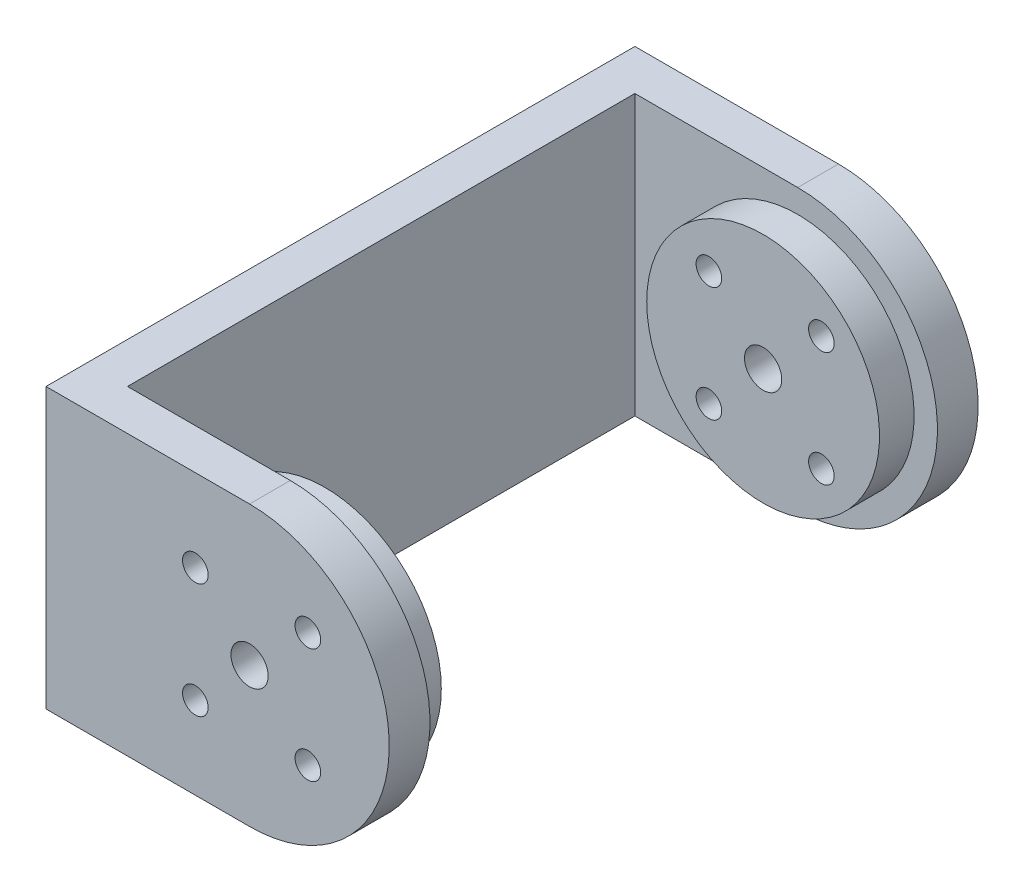
ISO-10303-21;
HEADER;
FILE_DESCRIPTION(('STEP AP214'),'2;1');
FILE_NAME('part.step','',(''),(''),'','','');
FILE_SCHEMA(('AUTOMOTIVE_DESIGN { 1 0 10303 214 1 1 1 1 }'));
ENDSEC;
DATA;
#1=APPLICATION_CONTEXT('core data for automotive mechanical design processes');
#2=APPLICATION_PROTOCOL_DEFINITION('international standard','automotive_design',2000,#1);
#3=PRODUCT_CONTEXT('',#1,'mechanical');
#4=PRODUCT('Part','Part','',(#3));
#5=PRODUCT_RELATED_PRODUCT_CATEGORY('part','',(#4));
#6=PRODUCT_DEFINITION_FORMATION('','',#4);
#7=PRODUCT_DEFINITION_CONTEXT('part definition',#1,'design');
#8=PRODUCT_DEFINITION('design','',#6,#7);
#9=PRODUCT_DEFINITION_SHAPE('','',#8);
#10=(LENGTH_UNIT() NAMED_UNIT(*) SI_UNIT(.MILLI.,.METRE.));
#11=(NAMED_UNIT(*) PLANE_ANGLE_UNIT() SI_UNIT($,.RADIAN.));
#12=(NAMED_UNIT(*) SI_UNIT($,.STERADIAN.) SOLID_ANGLE_UNIT());
#13=UNCERTAINTY_MEASURE_WITH_UNIT(LENGTH_MEASURE(1.E-05),#10,'distance_accuracy_value','');
#14=(GEOMETRIC_REPRESENTATION_CONTEXT(3) GLOBAL_UNCERTAINTY_ASSIGNED_CONTEXT((#13)) GLOBAL_UNIT_ASSIGNED_CONTEXT((#10,
#11,#12)) REPRESENTATION_CONTEXT('',''));
#15=CARTESIAN_POINT('',(0.,0.,0.));
#16=DIRECTION('',(0.,0.,1.));
#17=DIRECTION('',(1.,0.,0.));
#18=AXIS2_PLACEMENT_3D('',#15,#16,#17);
#19=CARTESIAN_POINT('',(-15.755,0.,25.3));
#20=DIRECTION('',(0.,0.,1.));
#21=DIRECTION('',(1.,0.,0.));
#22=AXIS2_PLACEMENT_3D('',#19,#20,#21);
#23=PLANE('',#22);
#24=CARTESIAN_POINT('',(-17.669,-4.934,25.3));
#25=DIRECTION('',(0.,0.,1.));
#26=DIRECTION('',(1.,0.,0.));
#27=AXIS2_PLACEMENT_3D('',#24,#25,#26);
#28=CIRCLE('',#27,1.1);
#29=CARTESIAN_POINT('',(-16.569,-4.934,25.3));
#30=VERTEX_POINT('',#29);
#31=EDGE_CURVE('E136',#30,#30,#28,.T.);
#32=ORIENTED_EDGE('',*,*,#31,.F.);
#33=EDGE_LOOP('',(#32));
#34=FACE_BOUND('',#33,.T.);
#35=CARTESIAN_POINT('',(-17.669,4.934,25.3));
#36=DIRECTION('',(0.,0.,1.));
#37=DIRECTION('',(1.,0.,0.));
#38=AXIS2_PLACEMENT_3D('',#35,#36,#37);
#39=CIRCLE('',#38,1.1);
#40=CARTESIAN_POINT('',(-16.569,4.934,25.3));
#41=VERTEX_POINT('',#40);
#42=EDGE_CURVE('E134',#41,#41,#39,.T.);
#43=ORIENTED_EDGE('',*,*,#42,.F.);
#44=EDGE_LOOP('',(#43));
#45=FACE_BOUND('',#44,.T.);
#46=CARTESIAN_POINT('',(-8.001,-4.934,25.3));
#47=DIRECTION('',(0.,0.,1.));
#48=DIRECTION('',(1.,0.,0.));
#49=AXIS2_PLACEMENT_3D('',#46,#47,#48);
#50=CIRCLE('',#49,1.1);
#51=CARTESIAN_POINT('',(-6.901,-4.934,25.3));
#52=VERTEX_POINT('',#51);
#53=EDGE_CURVE('E131',#52,#52,#50,.T.);
#54=ORIENTED_EDGE('',*,*,#53,.F.);
#55=EDGE_LOOP('',(#54));
#56=FACE_BOUND('',#55,.T.);
#57=CARTESIAN_POINT('',(-8.001,4.934,25.3));
#58=DIRECTION('',(0.,0.,1.));
#59=DIRECTION('',(1.,0.,0.));
#60=AXIS2_PLACEMENT_3D('',#57,#58,#59);
#61=CIRCLE('',#60,1.1);
#62=CARTESIAN_POINT('',(-6.901,4.934,25.3));
#63=VERTEX_POINT('',#62);
#64=EDGE_CURVE('E130',#63,#63,#61,.T.);
#65=ORIENTED_EDGE('',*,*,#64,.F.);
#66=EDGE_LOOP('',(#65));
#67=FACE_BOUND('',#66,.T.);
#68=CARTESIAN_POINT('',(-13.01,0.,25.3));
#69=DIRECTION('',(0.,0.,1.));
#70=DIRECTION('',(1.,0.,0.));
#71=AXIS2_PLACEMENT_3D('',#68,#69,#70);
#72=CIRCLE('',#71,1.6);
#73=CARTESIAN_POINT('',(-11.41,0.,25.3));
#74=VERTEX_POINT('',#73);
#75=EDGE_CURVE('E178',#74,#74,#72,.T.);
#76=ORIENTED_EDGE('',*,*,#75,.F.);
#77=EDGE_LOOP('',(#76));
#78=FACE_BOUND('',#77,.T.);
#79=CARTESIAN_POINT('',(-13.01,0.,25.3));
#80=DIRECTION('',(0.,0.,1.));
#81=DIRECTION('',(1.,0.,0.));
#82=AXIS2_PLACEMENT_3D('',#79,#80,#81);
#83=CIRCLE('',#82,12.);
#84=CARTESIAN_POINT('',(-13.01,-12.,25.3));
#85=VERTEX_POINT('',#84);
#86=CARTESIAN_POINT('',(-13.01,12.,25.3));
#87=VERTEX_POINT('',#86);
#88=EDGE_CURVE('E78',#85,#87,#83,.T.);
#89=ORIENTED_EDGE('',*,*,#88,.T.);
#90=DIRECTION('',(1.,0.,0.));
#91=VECTOR('',#90,1.);
#92=CARTESIAN_POINT('',(-15.755,12.,25.3));
#93=LINE('',#92,#91);
#94=CARTESIAN_POINT('',(-30.5,12.,25.3));
#95=VERTEX_POINT('',#94);
#96=EDGE_CURVE('E85',#95,#87,#93,.T.);
#97=ORIENTED_EDGE('',*,*,#96,.F.);
#98=DIRECTION('',(0.,1.,0.));
#99=VECTOR('',#98,1.);
#100=CARTESIAN_POINT('',(-30.5,0.,25.3));
#101=LINE('',#100,#99);
#102=CARTESIAN_POINT('',(-30.5,-12.,25.3));
#103=VERTEX_POINT('',#102);
#104=EDGE_CURVE('E99',#103,#95,#101,.T.);
#105=ORIENTED_EDGE('',*,*,#104,.F.);
#106=DIRECTION('',(-1.,0.,0.));
#107=VECTOR('',#106,1.);
#108=CARTESIAN_POINT('',(-15.755,-12.,25.3));
#109=LINE('',#108,#107);
#110=EDGE_CURVE('E36',#85,#103,#109,.T.);
#111=ORIENTED_EDGE('',*,*,#110,.F.);
#112=EDGE_LOOP('',(#89,#97,#105,#111));
#113=FACE_BOUND('',#112,.T.);
#114=ADVANCED_FACE('F15',(#34,#45,#56,#67,#78,#113),#23,.T.);
#115=CARTESIAN_POINT('',(-15.755,-12.,-25.3));
#116=DIRECTION('',(0.,-1.,0.));
#117=DIRECTION('',(0.,0.,-1.));
#118=AXIS2_PLACEMENT_3D('',#115,#116,#117);
#119=PLANE('',#118);
#120=DIRECTION('',(1.,0.,0.));
#121=VECTOR('',#120,1.);
#122=CARTESIAN_POINT('',(-15.755,-12.,-25.3));
#123=LINE('',#122,#121);
#124=CARTESIAN_POINT('',(-30.5,-12.,-25.3));
#125=VERTEX_POINT('',#124);
#126=CARTESIAN_POINT('',(-13.01,-12.,-25.3));
#127=VERTEX_POINT('',#126);
#128=EDGE_CURVE('E203',#125,#127,#123,.T.);
#129=ORIENTED_EDGE('',*,*,#128,.T.);
#130=DIRECTION('',(0.,0.,1.));
#131=VECTOR('',#130,1.);
#132=CARTESIAN_POINT('',(-13.01,-12.,-27.3));
#133=LINE('',#132,#131);
#134=CARTESIAN_POINT('',(-13.01,-12.,-21.8));
#135=VERTEX_POINT('',#134);
#136=EDGE_CURVE('E181',#127,#135,#133,.T.);
#137=ORIENTED_EDGE('',*,*,#136,.T.);
#138=DIRECTION('',(1.,0.,0.));
#139=VECTOR('',#138,1.);
#140=CARTESIAN_POINT('',(-15.755,-12.,-21.8));
#141=LINE('',#140,#139);
#142=CARTESIAN_POINT('',(-27.,-12.,-21.8));
#143=VERTEX_POINT('',#142);
#144=EDGE_CURVE('E189',#143,#135,#141,.T.);
#145=ORIENTED_EDGE('',*,*,#144,.F.);
#146=DIRECTION('',(0.,0.,-1.));
#147=VECTOR('',#146,1.);
#148=CARTESIAN_POINT('',(-27.,-12.,-25.3));
#149=LINE('',#148,#147);
#150=CARTESIAN_POINT('',(-27.,-12.,21.8));
#151=VERTEX_POINT('',#150);
#152=EDGE_CURVE('E200',#151,#143,#149,.T.);
#153=ORIENTED_EDGE('',*,*,#152,.F.);
#154=DIRECTION('',(-1.,0.,0.));
#155=VECTOR('',#154,1.);
#156=CARTESIAN_POINT('',(-15.755,-12.,21.8));
#157=LINE('',#156,#155);
#158=CARTESIAN_POINT('',(-13.01,-12.,21.8));
#159=VERTEX_POINT('',#158);
#160=EDGE_CURVE('E111',#159,#151,#157,.T.);
#161=ORIENTED_EDGE('',*,*,#160,.F.);
#162=EDGE_CURVE('E33',#159,#85,#133,.T.);
#163=ORIENTED_EDGE('',*,*,#162,.T.);
#164=ORIENTED_EDGE('',*,*,#110,.T.);
#165=DIRECTION('',(0.,0.,1.));
#166=VECTOR('',#165,1.);
#167=CARTESIAN_POINT('',(-30.5,-12.,-25.3));
#168=LINE('',#167,#166);
#169=EDGE_CURVE('E101',#125,#103,#168,.T.);
#170=ORIENTED_EDGE('',*,*,#169,.F.);
#171=EDGE_LOOP('',(#129,#137,#145,#153,#161,#163,#164,#170));
#172=FACE_BOUND('',#171,.T.);
#173=ADVANCED_FACE('F220',(#172),#119,.T.);
#174=CARTESIAN_POINT('',(-15.755,0.,-25.3));
#175=DIRECTION('',(0.,0.,-1.));
#176=DIRECTION('',(-1.,0.,0.));
#177=AXIS2_PLACEMENT_3D('',#174,#175,#176);
#178=PLANE('',#177);
#179=CARTESIAN_POINT('',(-17.669,-4.934,-25.3));
#180=DIRECTION('',(0.,0.,-1.));
#181=DIRECTION('',(-1.,0.,0.));
#182=AXIS2_PLACEMENT_3D('',#179,#180,#181);
#183=CIRCLE('',#182,1.1);
#184=CARTESIAN_POINT('',(-18.769,-4.934,-25.3));
#185=VERTEX_POINT('',#184);
#186=EDGE_CURVE('E148',#185,#185,#183,.T.);
#187=ORIENTED_EDGE('',*,*,#186,.F.);
#188=EDGE_LOOP('',(#187));
#189=FACE_BOUND('',#188,.T.);
#190=CARTESIAN_POINT('',(-17.669,4.934,-25.3));
#191=DIRECTION('',(0.,0.,-1.));
#192=DIRECTION('',(-1.,0.,0.));
#193=AXIS2_PLACEMENT_3D('',#190,#191,#192);
#194=CIRCLE('',#193,1.1);
#195=CARTESIAN_POINT('',(-18.769,4.934,-25.3));
#196=VERTEX_POINT('',#195);
#197=EDGE_CURVE('E141',#196,#196,#194,.T.);
#198=ORIENTED_EDGE('',*,*,#197,.F.);
#199=EDGE_LOOP('',(#198));
#200=FACE_BOUND('',#199,.T.);
#201=CARTESIAN_POINT('',(-8.001,-4.934,-25.3));
#202=DIRECTION('',(0.,0.,-1.));
#203=DIRECTION('',(-1.,0.,0.));
#204=AXIS2_PLACEMENT_3D('',#201,#202,#203);
#205=CIRCLE('',#204,1.1);
#206=CARTESIAN_POINT('',(-9.101,-4.934,-25.3));
#207=VERTEX_POINT('',#206);
#208=EDGE_CURVE('E161',#207,#207,#205,.T.);
#209=ORIENTED_EDGE('',*,*,#208,.F.);
#210=EDGE_LOOP('',(#209));
#211=FACE_BOUND('',#210,.T.);
#212=CARTESIAN_POINT('',(-8.001,4.934,-25.3));
#213=DIRECTION('',(0.,0.,-1.));
#214=DIRECTION('',(-1.,0.,0.));
#215=AXIS2_PLACEMENT_3D('',#212,#213,#214);
#216=CIRCLE('',#215,1.1);
#217=CARTESIAN_POINT('',(-9.101,4.934,-25.3));
#218=VERTEX_POINT('',#217);
#219=EDGE_CURVE('E169',#218,#218,#216,.T.);
#220=ORIENTED_EDGE('',*,*,#219,.F.);
#221=EDGE_LOOP('',(#220));
#222=FACE_BOUND('',#221,.T.);
#223=CARTESIAN_POINT('',(-13.01,0.,-25.3));
#224=DIRECTION('',(0.,0.,-1.));
#225=DIRECTION('',(-1.,0.,0.));
#226=AXIS2_PLACEMENT_3D('',#223,#224,#225);
#227=CIRCLE('',#226,1.6);
#228=CARTESIAN_POINT('',(-14.61,0.,-25.3));
#229=VERTEX_POINT('',#228);
#230=EDGE_CURVE('E175',#229,#229,#227,.T.);
#231=ORIENTED_EDGE('',*,*,#230,.F.);
#232=EDGE_LOOP('',(#231));
#233=FACE_BOUND('',#232,.T.);
#234=DIRECTION('',(-1.,0.,0.));
#235=VECTOR('',#234,1.);
#236=CARTESIAN_POINT('',(-15.755,12.,-25.3));
#237=LINE('',#236,#235);
#238=CARTESIAN_POINT('',(-13.01,12.,-25.3));
#239=VERTEX_POINT('',#238);
#240=CARTESIAN_POINT('',(-30.5,12.,-25.3));
#241=VERTEX_POINT('',#240);
#242=EDGE_CURVE('E202',#239,#241,#237,.T.);
#243=ORIENTED_EDGE('',*,*,#242,.F.);
#244=CARTESIAN_POINT('',(-13.01,0.,-25.3));
#245=DIRECTION('',(0.,0.,-1.));
#246=DIRECTION('',(-1.,0.,0.));
#247=AXIS2_PLACEMENT_3D('',#244,#245,#246);
#248=CIRCLE('',#247,12.);
#249=EDGE_CURVE('E83',#239,#127,#248,.T.);
#250=ORIENTED_EDGE('',*,*,#249,.T.);
#251=ORIENTED_EDGE('',*,*,#128,.F.);
#252=DIRECTION('',(0.,-1.,0.));
#253=VECTOR('',#252,1.);
#254=CARTESIAN_POINT('',(-30.5,0.,-25.3));
#255=LINE('',#254,#253);
#256=EDGE_CURVE('E204',#241,#125,#255,.T.);
#257=ORIENTED_EDGE('',*,*,#256,.F.);
#258=EDGE_LOOP('',(#243,#250,#251,#257));
#259=FACE_BOUND('',#258,.T.);
#260=ADVANCED_FACE('F212',(#189,#200,#211,#222,#233,#259),#178,.T.);
#261=CARTESIAN_POINT('',(-13.005,0.,21.8));
#262=DIRECTION('',(0.,0.,1.));
#263=DIRECTION('',(1.,0.,0.));
#264=AXIS2_PLACEMENT_3D('',#261,#262,#263);
#265=PLANE('',#264);
#266=CARTESIAN_POINT('',(-13.01,0.,21.8));
#267=DIRECTION('',(0.,0.,1.));
#268=DIRECTION('',(1.,0.,0.));
#269=AXIS2_PLACEMENT_3D('',#266,#267,#268);
#270=CIRCLE('',#269,10.);
#271=CARTESIAN_POINT('',(-3.01,0.,21.8));
#272=VERTEX_POINT('',#271);
#273=EDGE_CURVE('E194',#272,#272,#270,.T.);
#274=ORIENTED_EDGE('',*,*,#273,.T.);
#275=EDGE_LOOP('',(#274));
#276=FACE_BOUND('',#275,.T.);
#277=DIRECTION('',(1.,0.,0.));
#278=VECTOR('',#277,1.);
#279=CARTESIAN_POINT('',(-15.755,12.,21.8));
#280=LINE('',#279,#278);
#281=CARTESIAN_POINT('',(-27.,12.,21.8));
#282=VERTEX_POINT('',#281);
#283=CARTESIAN_POINT('',(-13.01,12.,21.8));
#284=VERTEX_POINT('',#283);
#285=EDGE_CURVE('E23',#282,#284,#280,.T.);
#286=ORIENTED_EDGE('',*,*,#285,.T.);
#287=CARTESIAN_POINT('',(-13.01,0.,21.8));
#288=DIRECTION('',(0.,0.,1.));
#289=DIRECTION('',(1.,0.,0.));
#290=AXIS2_PLACEMENT_3D('',#287,#288,#289);
#291=CIRCLE('',#290,12.);
#292=EDGE_CURVE('E89',#159,#284,#291,.T.);
#293=ORIENTED_EDGE('',*,*,#292,.F.);
#294=ORIENTED_EDGE('',*,*,#160,.T.);
#295=DIRECTION('',(0.,1.,0.));
#296=VECTOR('',#295,1.);
#297=CARTESIAN_POINT('',(-27.,0.,21.8));
#298=LINE('',#297,#296);
#299=EDGE_CURVE('E113',#151,#282,#298,.T.);
#300=ORIENTED_EDGE('',*,*,#299,.T.);
#301=EDGE_LOOP('',(#286,#293,#294,#300));
#302=FACE_BOUND('',#301,.T.);
#303=ADVANCED_FACE('F235',(#276,#302),#265,.F.);
#304=CARTESIAN_POINT('',(-13.005,0.,-21.8));
#305=DIRECTION('',(0.,0.,-1.));
#306=DIRECTION('',(-1.,0.,0.));
#307=AXIS2_PLACEMENT_3D('',#304,#305,#306);
#308=PLANE('',#307);
#309=CARTESIAN_POINT('',(-13.01,0.,-21.8));
#310=DIRECTION('',(0.,0.,-1.));
#311=DIRECTION('',(-1.,0.,0.));
#312=AXIS2_PLACEMENT_3D('',#309,#310,#311);
#313=CIRCLE('',#312,10.);
#314=CARTESIAN_POINT('',(-23.01,0.,-21.8));
#315=VERTEX_POINT('',#314);
#316=EDGE_CURVE('E81',#315,#315,#313,.T.);
#317=ORIENTED_EDGE('',*,*,#316,.T.);
#318=EDGE_LOOP('',(#317));
#319=FACE_BOUND('',#318,.T.);
#320=CARTESIAN_POINT('',(-13.01,0.,-21.8));
#321=DIRECTION('',(0.,0.,-1.));
#322=DIRECTION('',(-1.,0.,0.));
#323=AXIS2_PLACEMENT_3D('',#320,#321,#322);
#324=CIRCLE('',#323,12.);
#325=CARTESIAN_POINT('',(-13.01,12.,-21.8));
#326=VERTEX_POINT('',#325);
#327=EDGE_CURVE('E9',#326,#135,#324,.T.);
#328=ORIENTED_EDGE('',*,*,#327,.F.);
#329=DIRECTION('',(-1.,0.,0.));
#330=VECTOR('',#329,1.);
#331=CARTESIAN_POINT('',(-15.755,12.,-21.8));
#332=LINE('',#331,#330);
#333=CARTESIAN_POINT('',(-27.,12.,-21.8));
#334=VERTEX_POINT('',#333);
#335=EDGE_CURVE('E118',#326,#334,#332,.T.);
#336=ORIENTED_EDGE('',*,*,#335,.T.);
#337=DIRECTION('',(0.,-1.,0.));
#338=VECTOR('',#337,1.);
#339=CARTESIAN_POINT('',(-27.,0.,-21.8));
#340=LINE('',#339,#338);
#341=EDGE_CURVE('E120',#334,#143,#340,.T.);
#342=ORIENTED_EDGE('',*,*,#341,.T.);
#343=ORIENTED_EDGE('',*,*,#144,.T.);
#344=EDGE_LOOP('',(#328,#336,#342,#343));
#345=FACE_BOUND('',#344,.T.);
#346=ADVANCED_FACE('F225',(#319,#345),#308,.F.);
#347=CARTESIAN_POINT('',(-30.5,0.,-25.3));
#348=DIRECTION('',(-1.,0.,0.));
#349=DIRECTION('',(0.,0.,1.));
#350=AXIS2_PLACEMENT_3D('',#347,#348,#349);
#351=PLANE('',#350);
#352=ORIENTED_EDGE('',*,*,#169,.T.);
#353=ORIENTED_EDGE('',*,*,#104,.T.);
#354=DIRECTION('',(0.,0.,1.));
#355=VECTOR('',#354,1.);
#356=CARTESIAN_POINT('',(-30.5,12.,-25.3));
#357=LINE('',#356,#355);
#358=EDGE_CURVE('E97',#241,#95,#357,.T.);
#359=ORIENTED_EDGE('',*,*,#358,.F.);
#360=ORIENTED_EDGE('',*,*,#256,.T.);
#361=EDGE_LOOP('',(#352,#353,#359,#360));
#362=FACE_BOUND('',#361,.T.);
#363=ADVANCED_FACE('F211',(#362),#351,.T.);
#364=CARTESIAN_POINT('',(-15.755,12.,-25.3));
#365=DIRECTION('',(0.,1.,0.));
#366=DIRECTION('',(0.,0.,1.));
#367=AXIS2_PLACEMENT_3D('',#364,#365,#366);
#368=PLANE('',#367);
#369=DIRECTION('',(0.,0.,1.));
#370=VECTOR('',#369,1.);
#371=CARTESIAN_POINT('',(-13.01,12.,-27.3));
#372=LINE('',#371,#370);
#373=EDGE_CURVE('E94',#326,#239,#372,.F.);
#374=ORIENTED_EDGE('',*,*,#373,.T.);
#375=ORIENTED_EDGE('',*,*,#242,.T.);
#376=ORIENTED_EDGE('',*,*,#358,.T.);
#377=ORIENTED_EDGE('',*,*,#96,.T.);
#378=EDGE_CURVE('E86',#87,#284,#372,.F.);
#379=ORIENTED_EDGE('',*,*,#378,.T.);
#380=ORIENTED_EDGE('',*,*,#285,.F.);
#381=DIRECTION('',(0.,0.,1.));
#382=VECTOR('',#381,1.);
#383=CARTESIAN_POINT('',(-27.,12.,-25.3));
#384=LINE('',#383,#382);
#385=EDGE_CURVE('E108',#334,#282,#384,.T.);
#386=ORIENTED_EDGE('',*,*,#385,.F.);
#387=ORIENTED_EDGE('',*,*,#335,.F.);
#388=EDGE_LOOP('',(#374,#375,#376,#377,#379,#380,#386,#387));
#389=FACE_BOUND('',#388,.T.);
#390=ADVANCED_FACE('F100',(#389),#368,.T.);
#391=CARTESIAN_POINT('',(-27.,0.,-18.825));
#392=DIRECTION('',(-1.,0.,0.));
#393=DIRECTION('',(0.,0.,1.));
#394=AXIS2_PLACEMENT_3D('',#391,#392,#393);
#395=PLANE('',#394);
#396=ORIENTED_EDGE('',*,*,#152,.T.);
#397=ORIENTED_EDGE('',*,*,#341,.F.);
#398=ORIENTED_EDGE('',*,*,#385,.T.);
#399=ORIENTED_EDGE('',*,*,#299,.F.);
#400=EDGE_LOOP('',(#396,#397,#398,#399));
#401=FACE_BOUND('',#400,.T.);
#402=ADVANCED_FACE('F229',(#401),#395,.F.);
#403=CARTESIAN_POINT('',(-13.01,0.,17.825));
#404=DIRECTION('',(0.,0.,1.));
#405=DIRECTION('',(1.,0.,0.));
#406=AXIS2_PLACEMENT_3D('',#403,#404,#405);
#407=CYLINDRICAL_SURFACE('',#406,10.);
#408=ORIENTED_EDGE('',*,*,#273,.F.);
#409=EDGE_LOOP('',(#408));
#410=FACE_BOUND('',#409,.T.);
#411=CARTESIAN_POINT('',(-13.01,0.,18.825));
#412=DIRECTION('',(0.,0.,1.));
#413=DIRECTION('',(1.,0.,0.));
#414=AXIS2_PLACEMENT_3D('',#411,#412,#413);
#415=CIRCLE('',#414,10.);
#416=CARTESIAN_POINT('',(-3.01,0.,18.825));
#417=VERTEX_POINT('',#416);
#418=EDGE_CURVE('E112',#417,#417,#415,.T.);
#419=ORIENTED_EDGE('',*,*,#418,.T.);
#420=EDGE_LOOP('',(#419));
#421=FACE_BOUND('',#420,.T.);
#422=ADVANCED_FACE('F271',(#410,#421),#407,.T.);
#423=CARTESIAN_POINT('',(-13.005,0.,18.825));
#424=DIRECTION('',(0.,0.,1.));
#425=DIRECTION('',(1.,0.,0.));
#426=AXIS2_PLACEMENT_3D('',#423,#424,#425);
#427=PLANE('',#426);
#428=CARTESIAN_POINT('',(-17.669,-4.934,18.825));
#429=DIRECTION('',(0.,0.,1.));
#430=DIRECTION('',(1.,0.,0.));
#431=AXIS2_PLACEMENT_3D('',#428,#429,#430);
#432=CIRCLE('',#431,1.1);
#433=CARTESIAN_POINT('',(-16.569,-4.934,18.825));
#434=VERTEX_POINT('',#433);
#435=EDGE_CURVE('E151',#434,#434,#432,.T.);
#436=ORIENTED_EDGE('',*,*,#435,.T.);
#437=EDGE_LOOP('',(#436));
#438=FACE_BOUND('',#437,.T.);
#439=CARTESIAN_POINT('',(-17.669,4.934,18.825));
#440=DIRECTION('',(0.,0.,1.));
#441=DIRECTION('',(1.,0.,0.));
#442=AXIS2_PLACEMENT_3D('',#439,#440,#441);
#443=CIRCLE('',#442,1.1);
#444=CARTESIAN_POINT('',(-16.569,4.934,18.825));
#445=VERTEX_POINT('',#444);
#446=EDGE_CURVE('E139',#445,#445,#443,.T.);
#447=ORIENTED_EDGE('',*,*,#446,.T.);
#448=EDGE_LOOP('',(#447));
#449=FACE_BOUND('',#448,.T.);
#450=CARTESIAN_POINT('',(-8.001,-4.934,18.825));
#451=DIRECTION('',(0.,0.,1.));
#452=DIRECTION('',(1.,0.,0.));
#453=AXIS2_PLACEMENT_3D('',#450,#451,#452);
#454=CIRCLE('',#453,1.1);
#455=CARTESIAN_POINT('',(-6.901,-4.934,18.825));
#456=VERTEX_POINT('',#455);
#457=EDGE_CURVE('E133',#456,#456,#454,.T.);
#458=ORIENTED_EDGE('',*,*,#457,.T.);
#459=EDGE_LOOP('',(#458));
#460=FACE_BOUND('',#459,.T.);
#461=CARTESIAN_POINT('',(-8.001,4.934,18.825));
#462=DIRECTION('',(0.,0.,1.));
#463=DIRECTION('',(1.,0.,0.));
#464=AXIS2_PLACEMENT_3D('',#461,#462,#463);
#465=CIRCLE('',#464,1.1);
#466=CARTESIAN_POINT('',(-6.901,4.934,18.825));
#467=VERTEX_POINT('',#466);
#468=EDGE_CURVE('E129',#467,#467,#465,.T.);
#469=ORIENTED_EDGE('',*,*,#468,.T.);
#470=EDGE_LOOP('',(#469));
#471=FACE_BOUND('',#470,.T.);
#472=CARTESIAN_POINT('',(-13.01,0.,18.825));
#473=DIRECTION('',(0.,0.,1.));
#474=DIRECTION('',(1.,0.,0.));
#475=AXIS2_PLACEMENT_3D('',#472,#473,#474);
#476=CIRCLE('',#475,1.6);
#477=CARTESIAN_POINT('',(-11.41,0.,18.825));
#478=VERTEX_POINT('',#477);
#479=EDGE_CURVE('E124',#478,#478,#476,.T.);
#480=ORIENTED_EDGE('',*,*,#479,.T.);
#481=EDGE_LOOP('',(#480));
#482=FACE_BOUND('',#481,.T.);
#483=ORIENTED_EDGE('',*,*,#418,.F.);
#484=EDGE_LOOP('',(#483));
#485=FACE_BOUND('',#484,.T.);
#486=ADVANCED_FACE('F268',(#438,#449,#460,#471,#482,#485),#427,.F.);
#487=CARTESIAN_POINT('',(-13.01,0.,-22.8));
#488=DIRECTION('',(0.,0.,1.));
#489=DIRECTION('',(1.,0.,0.));
#490=AXIS2_PLACEMENT_3D('',#487,#488,#489);
#491=CYLINDRICAL_SURFACE('',#490,10.);
#492=ORIENTED_EDGE('',*,*,#316,.F.);
#493=EDGE_LOOP('',(#492));
#494=FACE_BOUND('',#493,.T.);
#495=CARTESIAN_POINT('',(-13.01,0.,-18.825));
#496=DIRECTION('',(0.,0.,-1.));
#497=DIRECTION('',(-1.,0.,0.));
#498=AXIS2_PLACEMENT_3D('',#495,#496,#497);
#499=CIRCLE('',#498,10.);
#500=CARTESIAN_POINT('',(-23.01,0.,-18.825));
#501=VERTEX_POINT('',#500);
#502=EDGE_CURVE('E117',#501,#501,#499,.T.);
#503=ORIENTED_EDGE('',*,*,#502,.T.);
#504=EDGE_LOOP('',(#503));
#505=FACE_BOUND('',#504,.T.);
#506=ADVANCED_FACE('F242',(#494,#505),#491,.T.);
#507=CARTESIAN_POINT('',(-13.005,0.,-18.825));
#508=DIRECTION('',(0.,0.,-1.));
#509=DIRECTION('',(-1.,0.,0.));
#510=AXIS2_PLACEMENT_3D('',#507,#508,#509);
#511=PLANE('',#510);
#512=CARTESIAN_POINT('',(-17.669,-4.934,-18.825));
#513=DIRECTION('',(0.,0.,-1.));
#514=DIRECTION('',(-1.,0.,0.));
#515=AXIS2_PLACEMENT_3D('',#512,#513,#514);
#516=CIRCLE('',#515,1.1);
#517=CARTESIAN_POINT('',(-18.769,-4.934,-18.825));
#518=VERTEX_POINT('',#517);
#519=EDGE_CURVE('E18',#518,#518,#516,.T.);
#520=ORIENTED_EDGE('',*,*,#519,.T.);
#521=EDGE_LOOP('',(#520));
#522=FACE_BOUND('',#521,.T.);
#523=CARTESIAN_POINT('',(-17.669,4.934,-18.825));
#524=DIRECTION('',(0.,0.,-1.));
#525=DIRECTION('',(-1.,0.,0.));
#526=AXIS2_PLACEMENT_3D('',#523,#524,#525);
#527=CIRCLE('',#526,1.1);
#528=CARTESIAN_POINT('',(-18.769,4.934,-18.825));
#529=VERTEX_POINT('',#528);
#530=EDGE_CURVE('E137',#529,#529,#527,.T.);
#531=ORIENTED_EDGE('',*,*,#530,.T.);
#532=EDGE_LOOP('',(#531));
#533=FACE_BOUND('',#532,.T.);
#534=CARTESIAN_POINT('',(-8.001,-4.934,-18.825));
#535=DIRECTION('',(0.,0.,-1.));
#536=DIRECTION('',(-1.,0.,0.));
#537=AXIS2_PLACEMENT_3D('',#534,#535,#536);
#538=CIRCLE('',#537,1.1);
#539=CARTESIAN_POINT('',(-9.101,-4.934,-18.825));
#540=VERTEX_POINT('',#539);
#541=EDGE_CURVE('E135',#540,#540,#538,.T.);
#542=ORIENTED_EDGE('',*,*,#541,.T.);
#543=EDGE_LOOP('',(#542));
#544=FACE_BOUND('',#543,.T.);
#545=CARTESIAN_POINT('',(-8.001,4.934,-18.825));
#546=DIRECTION('',(0.,0.,-1.));
#547=DIRECTION('',(-1.,0.,0.));
#548=AXIS2_PLACEMENT_3D('',#545,#546,#547);
#549=CIRCLE('',#548,1.1);
#550=CARTESIAN_POINT('',(-9.101,4.934,-18.825));
#551=VERTEX_POINT('',#550);
#552=EDGE_CURVE('E126',#551,#551,#549,.T.);
#553=ORIENTED_EDGE('',*,*,#552,.T.);
#554=EDGE_LOOP('',(#553));
#555=FACE_BOUND('',#554,.T.);
#556=CARTESIAN_POINT('',(-13.01,0.,-18.825));
#557=DIRECTION('',(0.,0.,-1.));
#558=DIRECTION('',(-1.,0.,0.));
#559=AXIS2_PLACEMENT_3D('',#556,#557,#558);
#560=CIRCLE('',#559,1.6);
#561=CARTESIAN_POINT('',(-14.61,0.,-18.825));
#562=VERTEX_POINT('',#561);
#563=EDGE_CURVE('E125',#562,#562,#560,.T.);
#564=ORIENTED_EDGE('',*,*,#563,.T.);
#565=EDGE_LOOP('',(#564));
#566=FACE_BOUND('',#565,.T.);
#567=ORIENTED_EDGE('',*,*,#502,.F.);
#568=EDGE_LOOP('',(#567));
#569=FACE_BOUND('',#568,.T.);
#570=ADVANCED_FACE('F234',(#522,#533,#544,#555,#566,#569),#511,.F.);
#571=CARTESIAN_POINT('',(-13.01,0.,-27.3));
#572=DIRECTION('',(0.,0.,1.));
#573=DIRECTION('',(1.,0.,0.));
#574=AXIS2_PLACEMENT_3D('',#571,#572,#573);
#575=CYLINDRICAL_SURFACE('',#574,12.);
#576=ORIENTED_EDGE('',*,*,#373,.F.);
#577=ORIENTED_EDGE('',*,*,#327,.T.);
#578=ORIENTED_EDGE('',*,*,#136,.F.);
#579=ORIENTED_EDGE('',*,*,#249,.F.);
#580=EDGE_LOOP('',(#576,#577,#578,#579));
#581=FACE_BOUND('',#580,.T.);
#582=ADVANCED_FACE('F233',(#581),#575,.T.);
#583=ORIENTED_EDGE('',*,*,#292,.T.);
#584=ORIENTED_EDGE('',*,*,#378,.F.);
#585=ORIENTED_EDGE('',*,*,#88,.F.);
#586=ORIENTED_EDGE('',*,*,#162,.F.);
#587=EDGE_LOOP('',(#583,#584,#585,#586));
#588=FACE_BOUND('',#587,.T.);
#589=ADVANCED_FACE('F90',(#588),#575,.T.);
#590=CARTESIAN_POINT('',(-13.01,0.,-27.3));
#591=DIRECTION('',(0.,0.,1.));
#592=DIRECTION('',(1.,0.,0.));
#593=AXIS2_PLACEMENT_3D('',#590,#591,#592);
#594=CYLINDRICAL_SURFACE('',#593,1.6);
#595=ORIENTED_EDGE('',*,*,#230,.T.);
#596=EDGE_LOOP('',(#595));
#597=FACE_BOUND('',#596,.T.);
#598=ORIENTED_EDGE('',*,*,#563,.F.);
#599=EDGE_LOOP('',(#598));
#600=FACE_BOUND('',#599,.T.);
#601=ADVANCED_FACE('F245',(#597,#600),#594,.F.);
#602=ORIENTED_EDGE('',*,*,#75,.T.);
#603=EDGE_LOOP('',(#602));
#604=FACE_BOUND('',#603,.T.);
#605=ORIENTED_EDGE('',*,*,#479,.F.);
#606=EDGE_LOOP('',(#605));
#607=FACE_BOUND('',#606,.T.);
#608=ADVANCED_FACE('F265',(#604,#607),#594,.F.);
#609=CARTESIAN_POINT('',(-8.001,4.934,-27.3));
#610=DIRECTION('',(0.,0.,1.));
#611=DIRECTION('',(1.,0.,0.));
#612=AXIS2_PLACEMENT_3D('',#609,#610,#611);
#613=CYLINDRICAL_SURFACE('',#612,1.1);
#614=ORIENTED_EDGE('',*,*,#219,.T.);
#615=EDGE_LOOP('',(#614));
#616=FACE_BOUND('',#615,.T.);
#617=ORIENTED_EDGE('',*,*,#552,.F.);
#618=EDGE_LOOP('',(#617));
#619=FACE_BOUND('',#618,.T.);
#620=ADVANCED_FACE('F264',(#616,#619),#613,.F.);
#621=ORIENTED_EDGE('',*,*,#64,.T.);
#622=EDGE_LOOP('',(#621));
#623=FACE_BOUND('',#622,.T.);
#624=ORIENTED_EDGE('',*,*,#468,.F.);
#625=EDGE_LOOP('',(#624));
#626=FACE_BOUND('',#625,.T.);
#627=ADVANCED_FACE('F357',(#623,#626),#613,.F.);
#628=CARTESIAN_POINT('',(-8.001,-4.934,-27.3));
#629=DIRECTION('',(0.,0.,1.));
#630=DIRECTION('',(1.,0.,0.));
#631=AXIS2_PLACEMENT_3D('',#628,#629,#630);
#632=CYLINDRICAL_SURFACE('',#631,1.1);
#633=ORIENTED_EDGE('',*,*,#208,.T.);
#634=EDGE_LOOP('',(#633));
#635=FACE_BOUND('',#634,.T.);
#636=ORIENTED_EDGE('',*,*,#541,.F.);
#637=EDGE_LOOP('',(#636));
#638=FACE_BOUND('',#637,.T.);
#639=ADVANCED_FACE('F368',(#635,#638),#632,.F.);
#640=ORIENTED_EDGE('',*,*,#53,.T.);
#641=EDGE_LOOP('',(#640));
#642=FACE_BOUND('',#641,.T.);
#643=ORIENTED_EDGE('',*,*,#457,.F.);
#644=EDGE_LOOP('',(#643));
#645=FACE_BOUND('',#644,.T.);
#646=ADVANCED_FACE('F374',(#642,#645),#632,.F.);
#647=CARTESIAN_POINT('',(-17.669,4.934,-27.3));
#648=DIRECTION('',(0.,0.,1.));
#649=DIRECTION('',(1.,0.,0.));
#650=AXIS2_PLACEMENT_3D('',#647,#648,#649);
#651=CYLINDRICAL_SURFACE('',#650,1.1);
#652=ORIENTED_EDGE('',*,*,#197,.T.);
#653=EDGE_LOOP('',(#652));
#654=FACE_BOUND('',#653,.T.);
#655=ORIENTED_EDGE('',*,*,#530,.F.);
#656=EDGE_LOOP('',(#655));
#657=FACE_BOUND('',#656,.T.);
#658=ADVANCED_FACE('F384',(#654,#657),#651,.F.);
#659=ORIENTED_EDGE('',*,*,#42,.T.);
#660=EDGE_LOOP('',(#659));
#661=FACE_BOUND('',#660,.T.);
#662=ORIENTED_EDGE('',*,*,#446,.F.);
#663=EDGE_LOOP('',(#662));
#664=FACE_BOUND('',#663,.T.);
#665=ADVANCED_FACE('F393',(#661,#664),#651,.F.);
#666=CARTESIAN_POINT('',(-17.669,-4.934,-27.3));
#667=DIRECTION('',(0.,0.,1.));
#668=DIRECTION('',(1.,0.,0.));
#669=AXIS2_PLACEMENT_3D('',#666,#667,#668);
#670=CYLINDRICAL_SURFACE('',#669,1.1);
#671=ORIENTED_EDGE('',*,*,#186,.T.);
#672=EDGE_LOOP('',(#671));
#673=FACE_BOUND('',#672,.T.);
#674=ORIENTED_EDGE('',*,*,#519,.F.);
#675=EDGE_LOOP('',(#674));
#676=FACE_BOUND('',#675,.T.);
#677=ADVANCED_FACE('F402',(#673,#676),#670,.F.);
#678=ORIENTED_EDGE('',*,*,#31,.T.);
#679=EDGE_LOOP('',(#678));
#680=FACE_BOUND('',#679,.T.);
#681=ORIENTED_EDGE('',*,*,#435,.F.);
#682=EDGE_LOOP('',(#681));
#683=FACE_BOUND('',#682,.T.);
#684=ADVANCED_FACE('F414',(#680,#683),#670,.F.);
#685=CLOSED_SHELL('',(#114,#173,#260,#303,#346,#363,#390,#402,#422,#486,#506,#570,#582,#589,
#601,#608,#620,#627,#639,#646,#658,#665,#677,#684));
#686=MANIFOLD_SOLID_BREP('B1',#685);
#687=ADVANCED_BREP_SHAPE_REPRESENTATION('',(#18,#686),#14);
#688=SHAPE_DEFINITION_REPRESENTATION(#9,#687);
ENDSEC;
END-ISO-10303-21;
